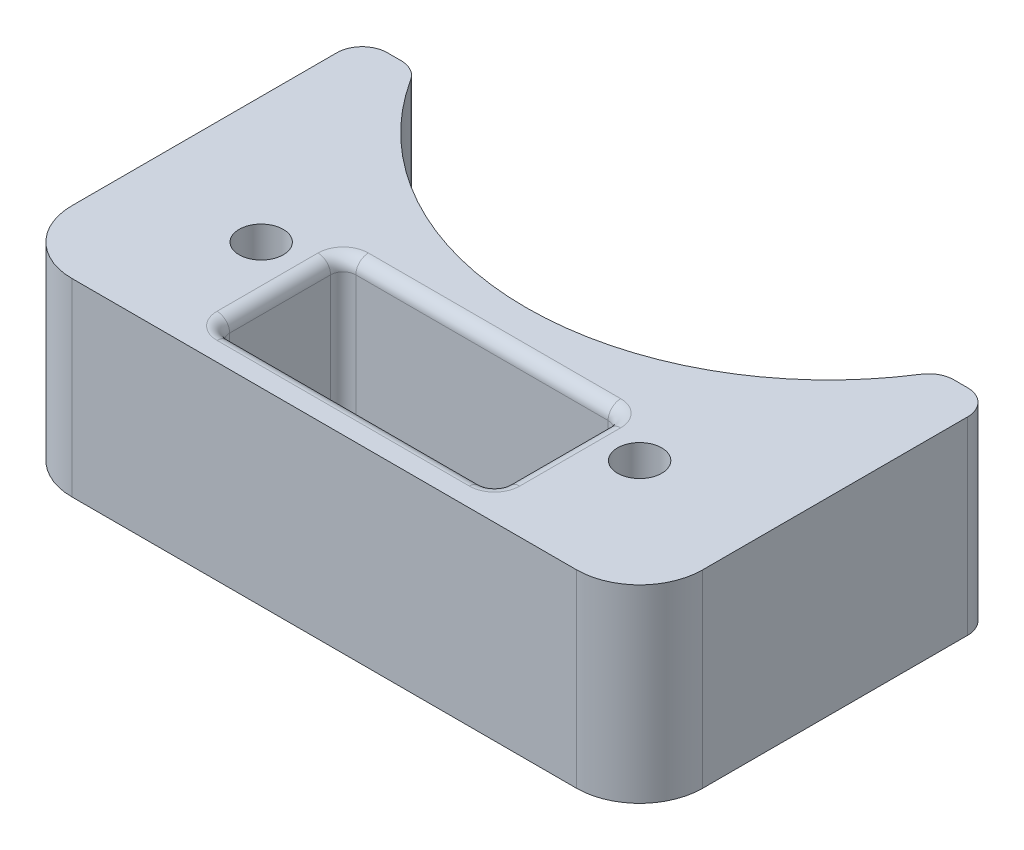
ISO-10303-21;
HEADER;
FILE_DESCRIPTION(('STEP AP214'),'2;1');
FILE_NAME('part.step','',(''),(''),'','','');
FILE_SCHEMA(('AUTOMOTIVE_DESIGN { 1 0 10303 214 1 1 1 1 }'));
ENDSEC;
DATA;
#1=APPLICATION_CONTEXT('core data for automotive mechanical design processes');
#2=APPLICATION_PROTOCOL_DEFINITION('international standard','automotive_design',2000,#1);
#3=PRODUCT_CONTEXT('',#1,'mechanical');
#4=PRODUCT('Part','Part','',(#3));
#5=PRODUCT_RELATED_PRODUCT_CATEGORY('part','',(#4));
#6=PRODUCT_DEFINITION_FORMATION('','',#4);
#7=PRODUCT_DEFINITION_CONTEXT('part definition',#1,'design');
#8=PRODUCT_DEFINITION('design','',#6,#7);
#9=PRODUCT_DEFINITION_SHAPE('','',#8);
#10=(LENGTH_UNIT() NAMED_UNIT(*) SI_UNIT(.MILLI.,.METRE.));
#11=(NAMED_UNIT(*) PLANE_ANGLE_UNIT() SI_UNIT($,.RADIAN.));
#12=(NAMED_UNIT(*) SI_UNIT($,.STERADIAN.) SOLID_ANGLE_UNIT());
#13=UNCERTAINTY_MEASURE_WITH_UNIT(LENGTH_MEASURE(1.E-05),#10,'distance_accuracy_value','');
#14=(GEOMETRIC_REPRESENTATION_CONTEXT(3) GLOBAL_UNCERTAINTY_ASSIGNED_CONTEXT((#13)) GLOBAL_UNIT_ASSIGNED_CONTEXT((#10,
#11,#12)) REPRESENTATION_CONTEXT('',''));
#15=CARTESIAN_POINT('',(0.,0.,0.));
#16=DIRECTION('',(0.,0.,1.));
#17=DIRECTION('',(1.,0.,0.));
#18=AXIS2_PLACEMENT_3D('',#15,#16,#17);
#19=CARTESIAN_POINT('',(0.,15.,0.));
#20=DIRECTION('',(0.,-1.,0.));
#21=DIRECTION('',(0.,0.,-1.));
#22=AXIS2_PLACEMENT_3D('',#19,#20,#21);
#23=PLANE('',#22);
#24=DIRECTION('',(0.,0.,1.));
#25=VECTOR('',#24,1.);
#26=CARTESIAN_POINT('',(-25.,15.,25.));
#27=LINE('',#26,#25);
#28=CARTESIAN_POINT('',(-25.,15.,14.));
#29=VERTEX_POINT('',#28);
#30=CARTESIAN_POINT('',(-25.,15.,35.));
#31=VERTEX_POINT('',#30);
#32=EDGE_CURVE('E301',#29,#31,#27,.T.);
#33=ORIENTED_EDGE('',*,*,#32,.T.);
#34=CARTESIAN_POINT('',(-20.,15.,35.));
#35=DIRECTION('',(0.,-1.,0.));
#36=DIRECTION('',(0.,0.,-1.));
#37=AXIS2_PLACEMENT_3D('',#34,#35,#36);
#38=CIRCLE('',#37,5.);
#39=CARTESIAN_POINT('',(-20.,15.,40.));
#40=VERTEX_POINT('',#39);
#41=EDGE_CURVE('E359',#31,#40,#38,.F.);
#42=ORIENTED_EDGE('',*,*,#41,.T.);
#43=DIRECTION('',(1.,0.,0.));
#44=VECTOR('',#43,1.);
#45=CARTESIAN_POINT('',(0.,15.,40.));
#46=LINE('',#45,#44);
#47=CARTESIAN_POINT('',(20.,15.,40.));
#48=VERTEX_POINT('',#47);
#49=EDGE_CURVE('E602',#40,#48,#46,.T.);
#50=ORIENTED_EDGE('',*,*,#49,.T.);
#51=CARTESIAN_POINT('',(20.,15.,35.));
#52=DIRECTION('',(0.,-1.,0.));
#53=DIRECTION('',(0.,0.,-1.));
#54=AXIS2_PLACEMENT_3D('',#51,#52,#53);
#55=CIRCLE('',#54,5.);
#56=CARTESIAN_POINT('',(25.,15.,35.));
#57=VERTEX_POINT('',#56);
#58=EDGE_CURVE('E356',#48,#57,#55,.F.);
#59=ORIENTED_EDGE('',*,*,#58,.T.);
#60=DIRECTION('',(0.,0.,-1.));
#61=VECTOR('',#60,1.);
#62=CARTESIAN_POINT('',(25.,15.,25.));
#63=LINE('',#62,#61);
#64=CARTESIAN_POINT('',(25.,15.,14.));
#65=VERTEX_POINT('',#64);
#66=EDGE_CURVE('E299',#57,#65,#63,.T.);
#67=ORIENTED_EDGE('',*,*,#66,.T.);
#68=CARTESIAN_POINT('',(23.,15.,14.));
#69=DIRECTION('',(0.,-1.,0.));
#70=DIRECTION('',(0.,0.,-1.));
#71=AXIS2_PLACEMENT_3D('',#68,#69,#70);
#72=CIRCLE('',#71,2.);
#73=CARTESIAN_POINT('',(23.,15.,12.));
#74=VERTEX_POINT('',#73);
#75=EDGE_CURVE('E259',#65,#74,#72,.F.);
#76=ORIENTED_EDGE('',*,*,#75,.T.);
#77=DIRECTION('',(1.,0.,0.));
#78=VECTOR('',#77,1.);
#79=CARTESIAN_POINT('',(0.,15.,12.));
#80=LINE('',#79,#78);
#81=CARTESIAN_POINT('',(21.9089023002066,15.,12.));
#82=VERTEX_POINT('',#81);
#83=EDGE_CURVE('E266',#82,#74,#80,.T.);
#84=ORIENTED_EDGE('',*,*,#83,.F.);
#85=CARTESIAN_POINT('',(21.9089023002066,15.,14.));
#86=DIRECTION('',(0.,-1.,0.));
#87=DIRECTION('',(0.,0.,-1.));
#88=AXIS2_PLACEMENT_3D('',#85,#86,#87);
#89=CIRCLE('',#88,2.);
#90=CARTESIAN_POINT('',(20.2236021232677,15.,12.9230769230769));
#91=VERTEX_POINT('',#90);
#92=EDGE_CURVE('E314',#82,#91,#89,.F.);
#93=ORIENTED_EDGE('',*,*,#92,.T.);
#94=CARTESIAN_POINT('',(0.,15.,0.));
#95=DIRECTION('',(0.,1.,0.));
#96=DIRECTION('',(0.,0.,1.));
#97=AXIS2_PLACEMENT_3D('',#94,#95,#96);
#98=CIRCLE('',#97,24.);
#99=CARTESIAN_POINT('',(-20.2236021232677,15.,12.9230769230769));
#100=VERTEX_POINT('',#99);
#101=EDGE_CURVE('E277',#100,#91,#98,.T.);
#102=ORIENTED_EDGE('',*,*,#101,.F.);
#103=CARTESIAN_POINT('',(-21.9089023002066,15.,14.));
#104=DIRECTION('',(0.,-1.,0.));
#105=DIRECTION('',(0.,0.,-1.));
#106=AXIS2_PLACEMENT_3D('',#103,#104,#105);
#107=CIRCLE('',#106,2.);
#108=CARTESIAN_POINT('',(-21.9089023002066,15.,12.));
#109=VERTEX_POINT('',#108);
#110=EDGE_CURVE('E248',#100,#109,#107,.F.);
#111=ORIENTED_EDGE('',*,*,#110,.T.);
#112=CARTESIAN_POINT('',(-23.,15.,12.));
#113=VERTEX_POINT('',#112);
#114=EDGE_CURVE('E254',#113,#109,#80,.T.);
#115=ORIENTED_EDGE('',*,*,#114,.F.);
#116=CARTESIAN_POINT('',(-23.,15.,14.));
#117=DIRECTION('',(0.,-1.,0.));
#118=DIRECTION('',(0.,0.,-1.));
#119=AXIS2_PLACEMENT_3D('',#116,#117,#118);
#120=CIRCLE('',#119,2.);
#121=EDGE_CURVE('E237',#113,#29,#120,.F.);
#122=ORIENTED_EDGE('',*,*,#121,.T.);
#123=EDGE_LOOP('',(#33,#42,#50,#59,#67,#76,#84,#93,#102,#111,#115,#122));
#124=FACE_BOUND('',#123,.T.);
#125=CARTESIAN_POINT('',(-15.,15.,30.));
#126=DIRECTION('',(0.,1.,0.));
#127=DIRECTION('',(0.,0.,1.));
#128=AXIS2_PLACEMENT_3D('',#125,#126,#127);
#129=CIRCLE('',#128,1.75);
#130=CARTESIAN_POINT('',(-15.,15.,31.75));
#131=VERTEX_POINT('',#130);
#132=EDGE_CURVE('E286',#131,#131,#129,.T.);
#133=ORIENTED_EDGE('',*,*,#132,.F.);
#134=EDGE_LOOP('',(#133));
#135=FACE_BOUND('',#134,.T.);
#136=CARTESIAN_POINT('',(15.,15.,30.));
#137=DIRECTION('',(0.,1.,0.));
#138=DIRECTION('',(0.,0.,1.));
#139=AXIS2_PLACEMENT_3D('',#136,#137,#138);
#140=CIRCLE('',#139,1.75);
#141=CARTESIAN_POINT('',(15.,15.,31.75));
#142=VERTEX_POINT('',#141);
#143=EDGE_CURVE('E290',#142,#142,#140,.T.);
#144=ORIENTED_EDGE('',*,*,#143,.F.);
#145=EDGE_LOOP('',(#144));
#146=FACE_BOUND('',#145,.T.);
#147=CARTESIAN_POINT('',(9.99999999999999,15.,28.5));
#148=DIRECTION('',(0.,-1.,0.));
#149=DIRECTION('',(0.,0.,-1.));
#150=AXIS2_PLACEMENT_3D('',#147,#148,#149);
#151=CIRCLE('',#150,2.);
#152=CARTESIAN_POINT('',(12.,15.,28.5));
#153=VERTEX_POINT('',#152);
#154=CARTESIAN_POINT('',(9.99999999999999,15.,26.5));
#155=VERTEX_POINT('',#154);
#156=EDGE_CURVE('E444',#153,#155,#151,.F.);
#157=ORIENTED_EDGE('',*,*,#156,.F.);
#158=DIRECTION('',(0.,0.,-1.));
#159=VECTOR('',#158,1.);
#160=CARTESIAN_POINT('',(12.,15.,0.));
#161=LINE('',#160,#159);
#162=CARTESIAN_POINT('',(12.,15.,36.5));
#163=VERTEX_POINT('',#162);
#164=EDGE_CURVE('E441',#153,#163,#161,.F.);
#165=ORIENTED_EDGE('',*,*,#164,.T.);
#166=CARTESIAN_POINT('',(9.99999999999999,15.,36.5));
#167=DIRECTION('',(0.,-1.,0.));
#168=DIRECTION('',(0.,0.,-1.));
#169=AXIS2_PLACEMENT_3D('',#166,#167,#168);
#170=CIRCLE('',#169,2.);
#171=CARTESIAN_POINT('',(9.99999999999999,15.,38.5));
#172=VERTEX_POINT('',#171);
#173=EDGE_CURVE('E437',#172,#163,#170,.F.);
#174=ORIENTED_EDGE('',*,*,#173,.F.);
#175=DIRECTION('',(1.,0.,0.));
#176=VECTOR('',#175,1.);
#177=CARTESIAN_POINT('',(0.,15.,38.5));
#178=LINE('',#177,#176);
#179=CARTESIAN_POINT('',(-10.,15.,38.5));
#180=VERTEX_POINT('',#179);
#181=EDGE_CURVE('E430',#172,#180,#178,.F.);
#182=ORIENTED_EDGE('',*,*,#181,.T.);
#183=CARTESIAN_POINT('',(-10.,15.,36.5));
#184=DIRECTION('',(0.,-1.,0.));
#185=DIRECTION('',(0.,0.,-1.));
#186=AXIS2_PLACEMENT_3D('',#183,#184,#185);
#187=CIRCLE('',#186,2.);
#188=CARTESIAN_POINT('',(-12.,15.,36.5));
#189=VERTEX_POINT('',#188);
#190=EDGE_CURVE('E426',#189,#180,#187,.F.);
#191=ORIENTED_EDGE('',*,*,#190,.F.);
#192=DIRECTION('',(0.,0.,1.));
#193=VECTOR('',#192,1.);
#194=CARTESIAN_POINT('',(-12.,15.,0.));
#195=LINE('',#194,#193);
#196=CARTESIAN_POINT('',(-12.,15.,28.5));
#197=VERTEX_POINT('',#196);
#198=EDGE_CURVE('E424',#189,#197,#195,.F.);
#199=ORIENTED_EDGE('',*,*,#198,.T.);
#200=CARTESIAN_POINT('',(-10.,15.,28.5));
#201=DIRECTION('',(0.,-1.,0.));
#202=DIRECTION('',(0.,0.,-1.));
#203=AXIS2_PLACEMENT_3D('',#200,#201,#202);
#204=CIRCLE('',#203,2.);
#205=CARTESIAN_POINT('',(-10.,15.,26.5));
#206=VERTEX_POINT('',#205);
#207=EDGE_CURVE('E420',#206,#197,#204,.F.);
#208=ORIENTED_EDGE('',*,*,#207,.F.);
#209=DIRECTION('',(-1.,0.,0.));
#210=VECTOR('',#209,1.);
#211=CARTESIAN_POINT('',(0.,15.,26.5));
#212=LINE('',#211,#210);
#213=EDGE_CURVE('E433',#206,#155,#212,.F.);
#214=ORIENTED_EDGE('',*,*,#213,.T.);
#215=EDGE_LOOP('',(#157,#165,#174,#182,#191,#199,#208,#214));
#216=FACE_BOUND('',#215,.T.);
#217=ADVANCED_FACE('F51',(#124,#135,#146,#216),#23,.F.);
#218=CARTESIAN_POINT('',(0.,0.,0.));
#219=DIRECTION('',(0.,-1.,0.));
#220=DIRECTION('',(0.,0.,-1.));
#221=AXIS2_PLACEMENT_3D('',#218,#219,#220);
#222=PLANE('',#221);
#223=DIRECTION('',(1.,0.,0.));
#224=VECTOR('',#223,1.);
#225=CARTESIAN_POINT('',(0.,0.,40.));
#226=LINE('',#225,#224);
#227=CARTESIAN_POINT('',(-20.,0.,40.));
#228=VERTEX_POINT('',#227);
#229=CARTESIAN_POINT('',(20.,0.,40.));
#230=VERTEX_POINT('',#229);
#231=EDGE_CURVE('E298',#228,#230,#226,.T.);
#232=ORIENTED_EDGE('',*,*,#231,.F.);
#233=CARTESIAN_POINT('',(-20.,0.,35.));
#234=DIRECTION('',(0.,-1.,0.));
#235=DIRECTION('',(0.,0.,-1.));
#236=AXIS2_PLACEMENT_3D('',#233,#234,#235);
#237=CIRCLE('',#236,5.);
#238=CARTESIAN_POINT('',(-25.,0.,35.));
#239=VERTEX_POINT('',#238);
#240=EDGE_CURVE('E372',#228,#239,#237,.T.);
#241=ORIENTED_EDGE('',*,*,#240,.T.);
#242=DIRECTION('',(0.,0.,1.));
#243=VECTOR('',#242,1.);
#244=CARTESIAN_POINT('',(-25.,0.,25.));
#245=LINE('',#244,#243);
#246=CARTESIAN_POINT('',(-25.,0.,14.));
#247=VERTEX_POINT('',#246);
#248=EDGE_CURVE('E302',#247,#239,#245,.T.);
#249=ORIENTED_EDGE('',*,*,#248,.F.);
#250=CARTESIAN_POINT('',(-23.,0.,14.));
#251=DIRECTION('',(0.,-1.,0.));
#252=DIRECTION('',(0.,0.,-1.));
#253=AXIS2_PLACEMENT_3D('',#250,#251,#252);
#254=CIRCLE('',#253,2.);
#255=CARTESIAN_POINT('',(-23.,0.,12.));
#256=VERTEX_POINT('',#255);
#257=EDGE_CURVE('E331',#247,#256,#254,.T.);
#258=ORIENTED_EDGE('',*,*,#257,.T.);
#259=DIRECTION('',(1.,0.,0.));
#260=VECTOR('',#259,1.);
#261=CARTESIAN_POINT('',(0.,0.,12.));
#262=LINE('',#261,#260);
#263=CARTESIAN_POINT('',(-21.9089023002066,0.,12.));
#264=VERTEX_POINT('',#263);
#265=EDGE_CURVE('E257',#256,#264,#262,.T.);
#266=ORIENTED_EDGE('',*,*,#265,.T.);
#267=CARTESIAN_POINT('',(-21.9089023002066,0.,14.));
#268=DIRECTION('',(0.,-1.,0.));
#269=DIRECTION('',(0.,0.,-1.));
#270=AXIS2_PLACEMENT_3D('',#267,#268,#269);
#271=CIRCLE('',#270,2.);
#272=CARTESIAN_POINT('',(-20.2236021232677,0.,12.9230769230769));
#273=VERTEX_POINT('',#272);
#274=EDGE_CURVE('E328',#264,#273,#271,.T.);
#275=ORIENTED_EDGE('',*,*,#274,.T.);
#276=CARTESIAN_POINT('',(0.,0.,0.));
#277=DIRECTION('',(0.,1.,0.));
#278=DIRECTION('',(0.,0.,1.));
#279=AXIS2_PLACEMENT_3D('',#276,#277,#278);
#280=CIRCLE('',#279,24.);
#281=CARTESIAN_POINT('',(20.2236021232677,0.,12.9230769230769));
#282=VERTEX_POINT('',#281);
#283=EDGE_CURVE('E265',#273,#282,#280,.T.);
#284=ORIENTED_EDGE('',*,*,#283,.T.);
#285=CARTESIAN_POINT('',(21.9089023002066,0.,14.));
#286=DIRECTION('',(0.,-1.,0.));
#287=DIRECTION('',(0.,0.,-1.));
#288=AXIS2_PLACEMENT_3D('',#285,#286,#287);
#289=CIRCLE('',#288,2.);
#290=CARTESIAN_POINT('',(21.9089023002066,0.,12.));
#291=VERTEX_POINT('',#290);
#292=EDGE_CURVE('E325',#282,#291,#289,.T.);
#293=ORIENTED_EDGE('',*,*,#292,.T.);
#294=CARTESIAN_POINT('',(23.,0.,12.));
#295=VERTEX_POINT('',#294);
#296=EDGE_CURVE('E273',#291,#295,#262,.T.);
#297=ORIENTED_EDGE('',*,*,#296,.T.);
#298=CARTESIAN_POINT('',(23.,0.,14.));
#299=DIRECTION('',(0.,-1.,0.));
#300=DIRECTION('',(0.,0.,-1.));
#301=AXIS2_PLACEMENT_3D('',#298,#299,#300);
#302=CIRCLE('',#301,2.);
#303=CARTESIAN_POINT('',(25.,0.,14.));
#304=VERTEX_POINT('',#303);
#305=EDGE_CURVE('E321',#295,#304,#302,.T.);
#306=ORIENTED_EDGE('',*,*,#305,.T.);
#307=DIRECTION('',(0.,0.,-1.));
#308=VECTOR('',#307,1.);
#309=CARTESIAN_POINT('',(25.,0.,25.));
#310=LINE('',#309,#308);
#311=CARTESIAN_POINT('',(25.,0.,35.));
#312=VERTEX_POINT('',#311);
#313=EDGE_CURVE('E285',#312,#304,#310,.T.);
#314=ORIENTED_EDGE('',*,*,#313,.F.);
#315=CARTESIAN_POINT('',(20.,0.,35.));
#316=DIRECTION('',(0.,-1.,0.));
#317=DIRECTION('',(0.,0.,-1.));
#318=AXIS2_PLACEMENT_3D('',#315,#316,#317);
#319=CIRCLE('',#318,5.);
#320=EDGE_CURVE('E369',#312,#230,#319,.T.);
#321=ORIENTED_EDGE('',*,*,#320,.T.);
#322=EDGE_LOOP('',(#232,#241,#249,#258,#266,#275,#284,#293,#297,#306,#314,#321));
#323=FACE_BOUND('',#322,.T.);
#324=CARTESIAN_POINT('',(-15.,0.,30.));
#325=DIRECTION('',(0.,1.,0.));
#326=DIRECTION('',(0.,0.,1.));
#327=AXIS2_PLACEMENT_3D('',#324,#325,#326);
#328=CIRCLE('',#327,1.75);
#329=CARTESIAN_POINT('',(-15.,0.,31.75));
#330=VERTEX_POINT('',#329);
#331=EDGE_CURVE('E281',#330,#330,#328,.T.);
#332=ORIENTED_EDGE('',*,*,#331,.T.);
#333=EDGE_LOOP('',(#332));
#334=FACE_BOUND('',#333,.T.);
#335=CARTESIAN_POINT('',(15.,0.,30.));
#336=DIRECTION('',(0.,1.,0.));
#337=DIRECTION('',(0.,0.,1.));
#338=AXIS2_PLACEMENT_3D('',#335,#336,#337);
#339=CIRCLE('',#338,1.75);
#340=CARTESIAN_POINT('',(15.,0.,31.75));
#341=VERTEX_POINT('',#340);
#342=EDGE_CURVE('E294',#341,#341,#339,.T.);
#343=ORIENTED_EDGE('',*,*,#342,.T.);
#344=EDGE_LOOP('',(#343));
#345=FACE_BOUND('',#344,.T.);
#346=CARTESIAN_POINT('',(9.99999999999999,0.,36.5));
#347=DIRECTION('',(0.,-1.,0.));
#348=DIRECTION('',(0.,0.,-1.));
#349=AXIS2_PLACEMENT_3D('',#346,#347,#348);
#350=CIRCLE('',#349,2.);
#351=CARTESIAN_POINT('',(12.,0.,36.5));
#352=VERTEX_POINT('',#351);
#353=CARTESIAN_POINT('',(9.99999999999999,0.,38.5));
#354=VERTEX_POINT('',#353);
#355=EDGE_CURVE('E403',#352,#354,#350,.T.);
#356=ORIENTED_EDGE('',*,*,#355,.F.);
#357=DIRECTION('',(0.,0.,-1.));
#358=VECTOR('',#357,1.);
#359=CARTESIAN_POINT('',(12.,0.,27.5));
#360=LINE('',#359,#358);
#361=CARTESIAN_POINT('',(12.,0.,28.5));
#362=VERTEX_POINT('',#361);
#363=EDGE_CURVE('E400',#352,#362,#360,.T.);
#364=ORIENTED_EDGE('',*,*,#363,.T.);
#365=CARTESIAN_POINT('',(9.99999999999999,0.,28.5));
#366=DIRECTION('',(0.,-1.,0.));
#367=DIRECTION('',(0.,0.,-1.));
#368=AXIS2_PLACEMENT_3D('',#365,#366,#367);
#369=CIRCLE('',#368,2.);
#370=CARTESIAN_POINT('',(9.99999999999999,0.,26.5));
#371=VERTEX_POINT('',#370);
#372=EDGE_CURVE('E396',#371,#362,#369,.T.);
#373=ORIENTED_EDGE('',*,*,#372,.F.);
#374=DIRECTION('',(-1.,0.,0.));
#375=VECTOR('',#374,1.);
#376=CARTESIAN_POINT('',(-11.,0.,26.5));
#377=LINE('',#376,#375);
#378=CARTESIAN_POINT('',(-10.,0.,26.5));
#379=VERTEX_POINT('',#378);
#380=EDGE_CURVE('E392',#371,#379,#377,.T.);
#381=ORIENTED_EDGE('',*,*,#380,.T.);
#382=CARTESIAN_POINT('',(-10.,0.,28.5));
#383=DIRECTION('',(0.,-1.,0.));
#384=DIRECTION('',(0.,0.,-1.));
#385=AXIS2_PLACEMENT_3D('',#382,#383,#384);
#386=CIRCLE('',#385,2.);
#387=CARTESIAN_POINT('',(-12.,0.,28.5));
#388=VERTEX_POINT('',#387);
#389=EDGE_CURVE('E388',#388,#379,#386,.T.);
#390=ORIENTED_EDGE('',*,*,#389,.F.);
#391=DIRECTION('',(0.,0.,1.));
#392=VECTOR('',#391,1.);
#393=CARTESIAN_POINT('',(-12.,0.,37.5));
#394=LINE('',#393,#392);
#395=CARTESIAN_POINT('',(-12.,0.,36.5));
#396=VERTEX_POINT('',#395);
#397=EDGE_CURVE('E382',#388,#396,#394,.T.);
#398=ORIENTED_EDGE('',*,*,#397,.T.);
#399=CARTESIAN_POINT('',(-10.,0.,36.5));
#400=DIRECTION('',(0.,-1.,0.));
#401=DIRECTION('',(0.,0.,-1.));
#402=AXIS2_PLACEMENT_3D('',#399,#400,#401);
#403=CIRCLE('',#402,2.);
#404=CARTESIAN_POINT('',(-10.,0.,38.5));
#405=VERTEX_POINT('',#404);
#406=EDGE_CURVE('E378',#405,#396,#403,.T.);
#407=ORIENTED_EDGE('',*,*,#406,.F.);
#408=DIRECTION('',(1.,0.,0.));
#409=VECTOR('',#408,1.);
#410=CARTESIAN_POINT('',(11.,0.,38.5));
#411=LINE('',#410,#409);
#412=EDGE_CURVE('E385',#405,#354,#411,.T.);
#413=ORIENTED_EDGE('',*,*,#412,.T.);
#414=EDGE_LOOP('',(#356,#364,#373,#381,#390,#398,#407,#413));
#415=FACE_BOUND('',#414,.T.);
#416=ADVANCED_FACE('F592',(#323,#334,#345,#415),#222,.T.);
#417=CARTESIAN_POINT('',(25.,15.,25.));
#418=DIRECTION('',(-1.,0.,0.));
#419=DIRECTION('',(0.,0.,1.));
#420=AXIS2_PLACEMENT_3D('',#417,#418,#419);
#421=PLANE('',#420);
#422=ORIENTED_EDGE('',*,*,#66,.F.);
#423=DIRECTION('',(0.,1.,0.));
#424=VECTOR('',#423,1.);
#425=CARTESIAN_POINT('',(25.,0.,35.));
#426=LINE('',#425,#424);
#427=EDGE_CURVE('E375',#57,#312,#426,.F.);
#428=ORIENTED_EDGE('',*,*,#427,.T.);
#429=ORIENTED_EDGE('',*,*,#313,.T.);
#430=DIRECTION('',(0.,1.,0.));
#431=VECTOR('',#430,1.);
#432=CARTESIAN_POINT('',(25.,15.,14.));
#433=LINE('',#432,#431);
#434=EDGE_CURVE('E348',#304,#65,#433,.T.);
#435=ORIENTED_EDGE('',*,*,#434,.T.);
#436=EDGE_LOOP('',(#422,#428,#429,#435));
#437=FACE_BOUND('',#436,.T.);
#438=ADVANCED_FACE('F623',(#437),#421,.F.);
#439=CARTESIAN_POINT('',(-25.,15.,25.));
#440=DIRECTION('',(1.,0.,0.));
#441=DIRECTION('',(0.,0.,-1.));
#442=AXIS2_PLACEMENT_3D('',#439,#440,#441);
#443=PLANE('',#442);
#444=ORIENTED_EDGE('',*,*,#248,.T.);
#445=DIRECTION('',(0.,1.,0.));
#446=VECTOR('',#445,1.);
#447=CARTESIAN_POINT('',(-25.,15.,35.));
#448=LINE('',#447,#446);
#449=EDGE_CURVE('E352',#239,#31,#448,.T.);
#450=ORIENTED_EDGE('',*,*,#449,.T.);
#451=ORIENTED_EDGE('',*,*,#32,.F.);
#452=DIRECTION('',(0.,1.,0.));
#453=VECTOR('',#452,1.);
#454=CARTESIAN_POINT('',(-25.,15.,14.));
#455=LINE('',#454,#453);
#456=EDGE_CURVE('E242',#29,#247,#455,.F.);
#457=ORIENTED_EDGE('',*,*,#456,.T.);
#458=EDGE_LOOP('',(#444,#450,#451,#457));
#459=FACE_BOUND('',#458,.T.);
#460=ADVANCED_FACE('F647',(#459),#443,.F.);
#461=CARTESIAN_POINT('',(15.,0.,30.));
#462=DIRECTION('',(0.,1.,0.));
#463=DIRECTION('',(0.,0.,1.));
#464=AXIS2_PLACEMENT_3D('',#461,#462,#463);
#465=CYLINDRICAL_SURFACE('',#464,1.75);
#466=ORIENTED_EDGE('',*,*,#342,.F.);
#467=EDGE_LOOP('',(#466));
#468=FACE_BOUND('',#467,.T.);
#469=ORIENTED_EDGE('',*,*,#143,.T.);
#470=EDGE_LOOP('',(#469));
#471=FACE_BOUND('',#470,.T.);
#472=ADVANCED_FACE('F644',(#468,#471),#465,.F.);
#473=CARTESIAN_POINT('',(-15.,0.,30.));
#474=DIRECTION('',(0.,1.,0.));
#475=DIRECTION('',(0.,0.,1.));
#476=AXIS2_PLACEMENT_3D('',#473,#474,#475);
#477=CYLINDRICAL_SURFACE('',#476,1.75);
#478=ORIENTED_EDGE('',*,*,#331,.F.);
#479=EDGE_LOOP('',(#478));
#480=FACE_BOUND('',#479,.T.);
#481=ORIENTED_EDGE('',*,*,#132,.T.);
#482=EDGE_LOOP('',(#481));
#483=FACE_BOUND('',#482,.T.);
#484=ADVANCED_FACE('F1021',(#480,#483),#477,.F.);
#485=CARTESIAN_POINT('',(0.,0.,0.));
#486=DIRECTION('',(0.,1.,0.));
#487=DIRECTION('',(0.,0.,1.));
#488=AXIS2_PLACEMENT_3D('',#485,#486,#487);
#489=CYLINDRICAL_SURFACE('',#488,24.);
#490=ORIENTED_EDGE('',*,*,#283,.F.);
#491=DIRECTION('',(0.,1.,0.));
#492=VECTOR('',#491,1.);
#493=CARTESIAN_POINT('',(-20.2236021232677,0.,12.9230769230769));
#494=LINE('',#493,#492);
#495=EDGE_CURVE('E337',#273,#100,#494,.T.);
#496=ORIENTED_EDGE('',*,*,#495,.T.);
#497=ORIENTED_EDGE('',*,*,#101,.T.);
#498=DIRECTION('',(0.,1.,0.));
#499=VECTOR('',#498,1.);
#500=CARTESIAN_POINT('',(20.2236021232677,0.,12.9230769230769));
#501=LINE('',#500,#499);
#502=EDGE_CURVE('E334',#91,#282,#501,.F.);
#503=ORIENTED_EDGE('',*,*,#502,.T.);
#504=EDGE_LOOP('',(#490,#496,#497,#503));
#505=FACE_BOUND('',#504,.T.);
#506=ADVANCED_FACE('F582',(#505),#489,.F.);
#507=CARTESIAN_POINT('',(0.,0.,12.));
#508=DIRECTION('',(0.,0.,1.));
#509=DIRECTION('',(1.,0.,0.));
#510=AXIS2_PLACEMENT_3D('',#507,#508,#509);
#511=PLANE('',#510);
#512=ORIENTED_EDGE('',*,*,#265,.F.);
#513=DIRECTION('',(0.,1.,0.));
#514=VECTOR('',#513,1.);
#515=CARTESIAN_POINT('',(-23.,0.,12.));
#516=LINE('',#515,#514);
#517=EDGE_CURVE('E241',#256,#113,#516,.T.);
#518=ORIENTED_EDGE('',*,*,#517,.T.);
#519=ORIENTED_EDGE('',*,*,#114,.T.);
#520=DIRECTION('',(0.,1.,0.));
#521=VECTOR('',#520,1.);
#522=CARTESIAN_POINT('',(-21.9089023002066,0.,12.));
#523=LINE('',#522,#521);
#524=EDGE_CURVE('E260',#109,#264,#523,.F.);
#525=ORIENTED_EDGE('',*,*,#524,.T.);
#526=EDGE_LOOP('',(#512,#518,#519,#525));
#527=FACE_BOUND('',#526,.T.);
#528=ADVANCED_FACE('F253',(#527),#511,.F.);
#529=ORIENTED_EDGE('',*,*,#296,.F.);
#530=DIRECTION('',(0.,1.,0.));
#531=VECTOR('',#530,1.);
#532=CARTESIAN_POINT('',(21.9089023002066,0.,12.));
#533=LINE('',#532,#531);
#534=EDGE_CURVE('E344',#291,#82,#533,.T.);
#535=ORIENTED_EDGE('',*,*,#534,.T.);
#536=ORIENTED_EDGE('',*,*,#83,.T.);
#537=DIRECTION('',(0.,1.,0.));
#538=VECTOR('',#537,1.);
#539=CARTESIAN_POINT('',(23.,0.,12.));
#540=LINE('',#539,#538);
#541=EDGE_CURVE('E341',#74,#295,#540,.F.);
#542=ORIENTED_EDGE('',*,*,#541,.T.);
#543=EDGE_LOOP('',(#529,#535,#536,#542));
#544=FACE_BOUND('',#543,.T.);
#545=ADVANCED_FACE('F596',(#544),#511,.F.);
#546=CARTESIAN_POINT('',(0.,0.,40.));
#547=DIRECTION('',(0.,0.,1.));
#548=DIRECTION('',(1.,0.,0.));
#549=AXIS2_PLACEMENT_3D('',#546,#547,#548);
#550=PLANE('',#549);
#551=ORIENTED_EDGE('',*,*,#49,.F.);
#552=DIRECTION('',(0.,1.,0.));
#553=VECTOR('',#552,1.);
#554=CARTESIAN_POINT('',(-20.,0.,40.));
#555=LINE('',#554,#553);
#556=EDGE_CURVE('E366',#40,#228,#555,.F.);
#557=ORIENTED_EDGE('',*,*,#556,.T.);
#558=ORIENTED_EDGE('',*,*,#231,.T.);
#559=DIRECTION('',(0.,1.,0.));
#560=VECTOR('',#559,1.);
#561=CARTESIAN_POINT('',(20.,15.,40.));
#562=LINE('',#561,#560);
#563=EDGE_CURVE('E362',#230,#48,#562,.T.);
#564=ORIENTED_EDGE('',*,*,#563,.T.);
#565=EDGE_LOOP('',(#551,#557,#558,#564));
#566=FACE_BOUND('',#565,.T.);
#567=ADVANCED_FACE('F613',(#566),#550,.T.);
#568=CARTESIAN_POINT('',(-23.,0.,14.));
#569=DIRECTION('',(0.,1.,0.));
#570=DIRECTION('',(0.,0.,1.));
#571=AXIS2_PLACEMENT_3D('',#568,#569,#570);
#572=CYLINDRICAL_SURFACE('',#571,2.);
#573=ORIENTED_EDGE('',*,*,#257,.F.);
#574=ORIENTED_EDGE('',*,*,#456,.F.);
#575=ORIENTED_EDGE('',*,*,#121,.F.);
#576=ORIENTED_EDGE('',*,*,#517,.F.);
#577=EDGE_LOOP('',(#573,#574,#575,#576));
#578=FACE_BOUND('',#577,.T.);
#579=ADVANCED_FACE('F240',(#578),#572,.T.);
#580=CARTESIAN_POINT('',(-21.9089023002066,0.,14.));
#581=DIRECTION('',(0.,1.,0.));
#582=DIRECTION('',(0.,0.,1.));
#583=AXIS2_PLACEMENT_3D('',#580,#581,#582);
#584=CYLINDRICAL_SURFACE('',#583,2.);
#585=ORIENTED_EDGE('',*,*,#274,.F.);
#586=ORIENTED_EDGE('',*,*,#524,.F.);
#587=ORIENTED_EDGE('',*,*,#110,.F.);
#588=ORIENTED_EDGE('',*,*,#495,.F.);
#589=EDGE_LOOP('',(#585,#586,#587,#588));
#590=FACE_BOUND('',#589,.T.);
#591=ADVANCED_FACE('F636',(#590),#584,.T.);
#592=CARTESIAN_POINT('',(21.9089023002066,0.,14.));
#593=DIRECTION('',(0.,1.,0.));
#594=DIRECTION('',(0.,0.,1.));
#595=AXIS2_PLACEMENT_3D('',#592,#593,#594);
#596=CYLINDRICAL_SURFACE('',#595,2.);
#597=ORIENTED_EDGE('',*,*,#292,.F.);
#598=ORIENTED_EDGE('',*,*,#502,.F.);
#599=ORIENTED_EDGE('',*,*,#92,.F.);
#600=ORIENTED_EDGE('',*,*,#534,.F.);
#601=EDGE_LOOP('',(#597,#598,#599,#600));
#602=FACE_BOUND('',#601,.T.);
#603=ADVANCED_FACE('F586',(#602),#596,.T.);
#604=CARTESIAN_POINT('',(23.,15.,14.));
#605=DIRECTION('',(0.,1.,0.));
#606=DIRECTION('',(0.,0.,1.));
#607=AXIS2_PLACEMENT_3D('',#604,#605,#606);
#608=CYLINDRICAL_SURFACE('',#607,2.);
#609=ORIENTED_EDGE('',*,*,#305,.F.);
#610=ORIENTED_EDGE('',*,*,#541,.F.);
#611=ORIENTED_EDGE('',*,*,#75,.F.);
#612=ORIENTED_EDGE('',*,*,#434,.F.);
#613=EDGE_LOOP('',(#609,#610,#611,#612));
#614=FACE_BOUND('',#613,.T.);
#615=ADVANCED_FACE('F627',(#614),#608,.T.);
#616=CARTESIAN_POINT('',(-20.,15.,35.));
#617=DIRECTION('',(0.,-1.,0.));
#618=DIRECTION('',(0.,0.,-1.));
#619=AXIS2_PLACEMENT_3D('',#616,#617,#618);
#620=CYLINDRICAL_SURFACE('',#619,5.);
#621=ORIENTED_EDGE('',*,*,#240,.F.);
#622=ORIENTED_EDGE('',*,*,#556,.F.);
#623=ORIENTED_EDGE('',*,*,#41,.F.);
#624=ORIENTED_EDGE('',*,*,#449,.F.);
#625=EDGE_LOOP('',(#621,#622,#623,#624));
#626=FACE_BOUND('',#625,.T.);
#627=ADVANCED_FACE('F629',(#626),#620,.T.);
#628=CARTESIAN_POINT('',(20.,0.,35.));
#629=DIRECTION('',(0.,-1.,0.));
#630=DIRECTION('',(0.,0.,-1.));
#631=AXIS2_PLACEMENT_3D('',#628,#629,#630);
#632=CYLINDRICAL_SURFACE('',#631,5.);
#633=ORIENTED_EDGE('',*,*,#320,.F.);
#634=ORIENTED_EDGE('',*,*,#427,.F.);
#635=ORIENTED_EDGE('',*,*,#58,.F.);
#636=ORIENTED_EDGE('',*,*,#563,.F.);
#637=EDGE_LOOP('',(#633,#634,#635,#636));
#638=FACE_BOUND('',#637,.T.);
#639=ADVANCED_FACE('F618',(#638),#632,.T.);
#640=CARTESIAN_POINT('',(11.,0.,37.5));
#641=DIRECTION('',(1.,0.,0.));
#642=DIRECTION('',(0.,0.,-1.));
#643=AXIS2_PLACEMENT_3D('',#640,#641,#642);
#644=PLANE('',#643);
#645=DIRECTION('',(0.,0.,-1.));
#646=VECTOR('',#645,1.);
#647=CARTESIAN_POINT('',(11.,1.,37.5));
#648=LINE('',#647,#646);
#649=CARTESIAN_POINT('',(11.,1.,28.5));
#650=VERTEX_POINT('',#649);
#651=CARTESIAN_POINT('',(11.,1.,36.5));
#652=VERTEX_POINT('',#651);
#653=EDGE_CURVE('E466',#650,#652,#648,.F.);
#654=ORIENTED_EDGE('',*,*,#653,.T.);
#655=DIRECTION('',(0.,1.,0.));
#656=VECTOR('',#655,1.);
#657=CARTESIAN_POINT('',(11.,15.,36.5));
#658=LINE('',#657,#656);
#659=CARTESIAN_POINT('',(11.,14.,36.5));
#660=VERTEX_POINT('',#659);
#661=EDGE_CURVE('E469',#652,#660,#658,.T.);
#662=ORIENTED_EDGE('',*,*,#661,.T.);
#663=DIRECTION('',(0.,0.,-1.));
#664=VECTOR('',#663,1.);
#665=CARTESIAN_POINT('',(11.,14.,37.5));
#666=LINE('',#665,#664);
#667=CARTESIAN_POINT('',(11.,14.,28.5));
#668=VERTEX_POINT('',#667);
#669=EDGE_CURVE('E460',#660,#668,#666,.T.);
#670=ORIENTED_EDGE('',*,*,#669,.T.);
#671=DIRECTION('',(0.,1.,0.));
#672=VECTOR('',#671,1.);
#673=CARTESIAN_POINT('',(11.,0.,28.5));
#674=LINE('',#673,#672);
#675=EDGE_CURVE('E463',#668,#650,#674,.F.);
#676=ORIENTED_EDGE('',*,*,#675,.T.);
#677=EDGE_LOOP('',(#654,#662,#670,#676));
#678=FACE_BOUND('',#677,.T.);
#679=ADVANCED_FACE('F709',(#678),#644,.F.);
#680=CARTESIAN_POINT('',(-11.,0.,37.5));
#681=DIRECTION('',(0.,0.,1.));
#682=DIRECTION('',(1.,0.,0.));
#683=AXIS2_PLACEMENT_3D('',#680,#681,#682);
#684=PLANE('',#683);
#685=DIRECTION('',(1.,0.,0.));
#686=VECTOR('',#685,1.);
#687=CARTESIAN_POINT('',(-11.,14.,37.5));
#688=LINE('',#687,#686);
#689=CARTESIAN_POINT('',(-10.,14.,37.5));
#690=VERTEX_POINT('',#689);
#691=CARTESIAN_POINT('',(9.99999999999999,14.,37.5));
#692=VERTEX_POINT('',#691);
#693=EDGE_CURVE('E450',#690,#692,#688,.T.);
#694=ORIENTED_EDGE('',*,*,#693,.T.);
#695=DIRECTION('',(0.,1.,0.));
#696=VECTOR('',#695,1.);
#697=CARTESIAN_POINT('',(9.99999999999999,0.,37.5));
#698=LINE('',#697,#696);
#699=CARTESIAN_POINT('',(9.99999999999999,1.,37.5));
#700=VERTEX_POINT('',#699);
#701=EDGE_CURVE('E457',#692,#700,#698,.F.);
#702=ORIENTED_EDGE('',*,*,#701,.T.);
#703=DIRECTION('',(1.,0.,0.));
#704=VECTOR('',#703,1.);
#705=CARTESIAN_POINT('',(-11.,1.,37.5));
#706=LINE('',#705,#704);
#707=CARTESIAN_POINT('',(-10.,1.,37.5));
#708=VERTEX_POINT('',#707);
#709=EDGE_CURVE('E453',#700,#708,#706,.F.);
#710=ORIENTED_EDGE('',*,*,#709,.T.);
#711=DIRECTION('',(0.,1.,0.));
#712=VECTOR('',#711,1.);
#713=CARTESIAN_POINT('',(-10.,15.,37.5));
#714=LINE('',#713,#712);
#715=EDGE_CURVE('E447',#708,#690,#714,.T.);
#716=ORIENTED_EDGE('',*,*,#715,.T.);
#717=EDGE_LOOP('',(#694,#702,#710,#716));
#718=FACE_BOUND('',#717,.T.);
#719=ADVANCED_FACE('F732',(#718),#684,.F.);
#720=CARTESIAN_POINT('',(-11.,0.,37.5));
#721=DIRECTION('',(-1.,0.,0.));
#722=DIRECTION('',(0.,0.,1.));
#723=AXIS2_PLACEMENT_3D('',#720,#721,#722);
#724=PLANE('',#723);
#725=DIRECTION('',(0.,0.,1.));
#726=VECTOR('',#725,1.);
#727=CARTESIAN_POINT('',(-11.,1.,27.5));
#728=LINE('',#727,#726);
#729=CARTESIAN_POINT('',(-11.,1.,36.5));
#730=VERTEX_POINT('',#729);
#731=CARTESIAN_POINT('',(-11.,1.,28.5));
#732=VERTEX_POINT('',#731);
#733=EDGE_CURVE('E61',#730,#732,#728,.F.);
#734=ORIENTED_EDGE('',*,*,#733,.T.);
#735=DIRECTION('',(0.,1.,0.));
#736=VECTOR('',#735,1.);
#737=CARTESIAN_POINT('',(-11.,15.,28.5));
#738=LINE('',#737,#736);
#739=CARTESIAN_POINT('',(-11.,14.,28.5));
#740=VERTEX_POINT('',#739);
#741=EDGE_CURVE('E11',#732,#740,#738,.T.);
#742=ORIENTED_EDGE('',*,*,#741,.T.);
#743=DIRECTION('',(0.,0.,1.));
#744=VECTOR('',#743,1.);
#745=CARTESIAN_POINT('',(-11.,14.,37.5));
#746=LINE('',#745,#744);
#747=CARTESIAN_POINT('',(-11.,14.,36.5));
#748=VERTEX_POINT('',#747);
#749=EDGE_CURVE('E473',#740,#748,#746,.T.);
#750=ORIENTED_EDGE('',*,*,#749,.T.);
#751=DIRECTION('',(0.,1.,0.));
#752=VECTOR('',#751,1.);
#753=CARTESIAN_POINT('',(-11.,0.,36.5));
#754=LINE('',#753,#752);
#755=EDGE_CURVE('E72',#748,#730,#754,.F.);
#756=ORIENTED_EDGE('',*,*,#755,.T.);
#757=EDGE_LOOP('',(#734,#742,#750,#756));
#758=FACE_BOUND('',#757,.T.);
#759=ADVANCED_FACE('F742',(#758),#724,.F.);
#760=CARTESIAN_POINT('',(-11.,0.,27.5));
#761=DIRECTION('',(0.,0.,-1.));
#762=DIRECTION('',(-1.,0.,0.));
#763=AXIS2_PLACEMENT_3D('',#760,#761,#762);
#764=PLANE('',#763);
#765=DIRECTION('',(-1.,0.,0.));
#766=VECTOR('',#765,1.);
#767=CARTESIAN_POINT('',(11.,1.,27.5));
#768=LINE('',#767,#766);
#769=CARTESIAN_POINT('',(-10.,1.,27.5));
#770=VERTEX_POINT('',#769);
#771=CARTESIAN_POINT('',(9.99999999999999,1.,27.5));
#772=VERTEX_POINT('',#771);
#773=EDGE_CURVE('E413',#770,#772,#768,.F.);
#774=ORIENTED_EDGE('',*,*,#773,.T.);
#775=DIRECTION('',(0.,1.,0.));
#776=VECTOR('',#775,1.);
#777=CARTESIAN_POINT('',(9.99999999999999,15.,27.5));
#778=LINE('',#777,#776);
#779=CARTESIAN_POINT('',(9.99999999999999,14.,27.5));
#780=VERTEX_POINT('',#779);
#781=EDGE_CURVE('E417',#772,#780,#778,.T.);
#782=ORIENTED_EDGE('',*,*,#781,.T.);
#783=DIRECTION('',(-1.,0.,0.));
#784=VECTOR('',#783,1.);
#785=CARTESIAN_POINT('',(-11.,14.,27.5));
#786=LINE('',#785,#784);
#787=CARTESIAN_POINT('',(-10.,14.,27.5));
#788=VERTEX_POINT('',#787);
#789=EDGE_CURVE('E410',#780,#788,#786,.T.);
#790=ORIENTED_EDGE('',*,*,#789,.T.);
#791=DIRECTION('',(0.,1.,0.));
#792=VECTOR('',#791,1.);
#793=CARTESIAN_POINT('',(-10.,0.,27.5));
#794=LINE('',#793,#792);
#795=EDGE_CURVE('E407',#788,#770,#794,.F.);
#796=ORIENTED_EDGE('',*,*,#795,.T.);
#797=EDGE_LOOP('',(#774,#782,#790,#796));
#798=FACE_BOUND('',#797,.T.);
#799=ADVANCED_FACE('F752',(#798),#764,.F.);
#800=CARTESIAN_POINT('',(-11.,14.,38.5));
#801=DIRECTION('',(1.,0.,0.));
#802=DIRECTION('',(0.,0.,-1.));
#803=AXIS2_PLACEMENT_3D('',#800,#801,#802);
#804=CYLINDRICAL_SURFACE('',#803,1.);
#805=CARTESIAN_POINT('',(-10.,14.,38.5));
#806=DIRECTION('',(-1.,0.,0.));
#807=DIRECTION('',(0.,0.,1.));
#808=AXIS2_PLACEMENT_3D('',#805,#806,#807);
#809=CIRCLE('',#808,1.);
#810=EDGE_CURVE('E563',#180,#690,#809,.T.);
#811=ORIENTED_EDGE('',*,*,#810,.F.);
#812=ORIENTED_EDGE('',*,*,#181,.F.);
#813=CARTESIAN_POINT('',(9.99999999999999,14.,38.5));
#814=DIRECTION('',(1.,0.,0.));
#815=DIRECTION('',(0.,0.,-1.));
#816=AXIS2_PLACEMENT_3D('',#813,#814,#815);
#817=CIRCLE('',#816,1.);
#818=EDGE_CURVE('E55',#692,#172,#817,.T.);
#819=ORIENTED_EDGE('',*,*,#818,.F.);
#820=ORIENTED_EDGE('',*,*,#693,.F.);
#821=EDGE_LOOP('',(#811,#812,#819,#820));
#822=FACE_BOUND('',#821,.T.);
#823=ADVANCED_FACE('F53',(#822),#804,.T.);
#824=CARTESIAN_POINT('',(9.99999999999999,14.,36.5));
#825=DIRECTION('',(0.,-1.,0.));
#826=DIRECTION('',(0.,0.,-1.));
#827=AXIS2_PLACEMENT_3D('',#824,#825,#826);
#828=TOROIDAL_SURFACE('',#827,2.,1.);
#829=ORIENTED_EDGE('',*,*,#818,.T.);
#830=ORIENTED_EDGE('',*,*,#173,.T.);
#831=CARTESIAN_POINT('',(12.,14.,36.5));
#832=DIRECTION('',(0.,0.,1.));
#833=DIRECTION('',(1.,0.,0.));
#834=AXIS2_PLACEMENT_3D('',#831,#832,#833);
#835=CIRCLE('',#834,1.);
#836=EDGE_CURVE('E560',#660,#163,#835,.F.);
#837=ORIENTED_EDGE('',*,*,#836,.F.);
#838=CARTESIAN_POINT('',(9.99999999999999,14.,36.5));
#839=DIRECTION('',(0.,-1.,0.));
#840=DIRECTION('',(0.,0.,-1.));
#841=AXIS2_PLACEMENT_3D('',#838,#839,#840);
#842=CIRCLE('',#841,1.);
#843=EDGE_CURVE('E556',#692,#660,#842,.F.);
#844=ORIENTED_EDGE('',*,*,#843,.F.);
#845=EDGE_LOOP('',(#829,#830,#837,#844));
#846=FACE_BOUND('',#845,.T.);
#847=ADVANCED_FACE('F769',(#846),#828,.T.);
#848=CARTESIAN_POINT('',(-10.,14.,36.5));
#849=DIRECTION('',(0.,-1.,0.));
#850=DIRECTION('',(0.,0.,-1.));
#851=AXIS2_PLACEMENT_3D('',#848,#849,#850);
#852=TOROIDAL_SURFACE('',#851,2.,1.);
#853=ORIENTED_EDGE('',*,*,#190,.T.);
#854=ORIENTED_EDGE('',*,*,#810,.T.);
#855=CARTESIAN_POINT('',(-10.,14.,36.5));
#856=DIRECTION('',(0.,-1.,0.));
#857=DIRECTION('',(0.,0.,-1.));
#858=AXIS2_PLACEMENT_3D('',#855,#856,#857);
#859=CIRCLE('',#858,1.);
#860=EDGE_CURVE('E552',#748,#690,#859,.F.);
#861=ORIENTED_EDGE('',*,*,#860,.F.);
#862=CARTESIAN_POINT('',(-12.,14.,36.5));
#863=DIRECTION('',(0.,0.,1.));
#864=DIRECTION('',(1.,0.,0.));
#865=AXIS2_PLACEMENT_3D('',#862,#863,#864);
#866=CIRCLE('',#865,1.);
#867=EDGE_CURVE('E548',#189,#748,#866,.F.);
#868=ORIENTED_EDGE('',*,*,#867,.F.);
#869=EDGE_LOOP('',(#853,#854,#861,#868));
#870=FACE_BOUND('',#869,.T.);
#871=ADVANCED_FACE('F778',(#870),#852,.T.);
#872=CARTESIAN_POINT('',(12.,14.,37.5));
#873=DIRECTION('',(0.,0.,-1.));
#874=DIRECTION('',(-1.,0.,0.));
#875=AXIS2_PLACEMENT_3D('',#872,#873,#874);
#876=CYLINDRICAL_SURFACE('',#875,1.);
#877=ORIENTED_EDGE('',*,*,#836,.T.);
#878=ORIENTED_EDGE('',*,*,#164,.F.);
#879=CARTESIAN_POINT('',(12.,14.,28.5));
#880=DIRECTION('',(0.,0.,-1.));
#881=DIRECTION('',(-1.,0.,0.));
#882=AXIS2_PLACEMENT_3D('',#879,#880,#881);
#883=CIRCLE('',#882,1.);
#884=EDGE_CURVE('E540',#668,#153,#883,.T.);
#885=ORIENTED_EDGE('',*,*,#884,.F.);
#886=ORIENTED_EDGE('',*,*,#669,.F.);
#887=EDGE_LOOP('',(#877,#878,#885,#886));
#888=FACE_BOUND('',#887,.T.);
#889=ADVANCED_FACE('F786',(#888),#876,.T.);
#890=CARTESIAN_POINT('',(9.99999999999999,0.,36.5));
#891=DIRECTION('',(0.,-1.,0.));
#892=DIRECTION('',(0.,0.,-1.));
#893=AXIS2_PLACEMENT_3D('',#890,#891,#892);
#894=CYLINDRICAL_SURFACE('',#893,1.);
#895=ORIENTED_EDGE('',*,*,#843,.T.);
#896=ORIENTED_EDGE('',*,*,#661,.F.);
#897=CARTESIAN_POINT('',(9.99999999999999,1.,36.5));
#898=DIRECTION('',(0.,-1.,0.));
#899=DIRECTION('',(0.,0.,-1.));
#900=AXIS2_PLACEMENT_3D('',#897,#898,#899);
#901=CIRCLE('',#900,1.);
#902=EDGE_CURVE('E536',#700,#652,#901,.F.);
#903=ORIENTED_EDGE('',*,*,#902,.F.);
#904=ORIENTED_EDGE('',*,*,#701,.F.);
#905=EDGE_LOOP('',(#895,#896,#903,#904));
#906=FACE_BOUND('',#905,.T.);
#907=ADVANCED_FACE('F795',(#906),#894,.F.);
#908=CARTESIAN_POINT('',(0.,1.,38.5));
#909=DIRECTION('',(-1.,0.,0.));
#910=DIRECTION('',(0.,0.,1.));
#911=AXIS2_PLACEMENT_3D('',#908,#909,#910);
#912=CYLINDRICAL_SURFACE('',#911,1.);
#913=CARTESIAN_POINT('',(-10.,1.,38.5));
#914=DIRECTION('',(-1.,0.,0.));
#915=DIRECTION('',(0.,0.,1.));
#916=AXIS2_PLACEMENT_3D('',#913,#914,#915);
#917=CIRCLE('',#916,1.);
#918=EDGE_CURVE('E528',#708,#405,#917,.T.);
#919=ORIENTED_EDGE('',*,*,#918,.F.);
#920=ORIENTED_EDGE('',*,*,#709,.F.);
#921=CARTESIAN_POINT('',(9.99999999999999,1.,38.5));
#922=DIRECTION('',(1.,0.,0.));
#923=DIRECTION('',(0.,0.,-1.));
#924=AXIS2_PLACEMENT_3D('',#921,#922,#923);
#925=CIRCLE('',#924,1.);
#926=EDGE_CURVE('E532',#354,#700,#925,.T.);
#927=ORIENTED_EDGE('',*,*,#926,.F.);
#928=ORIENTED_EDGE('',*,*,#412,.F.);
#929=EDGE_LOOP('',(#919,#920,#927,#928));
#930=FACE_BOUND('',#929,.T.);
#931=ADVANCED_FACE('F805',(#930),#912,.T.);
#932=CARTESIAN_POINT('',(-10.,0.,36.5));
#933=DIRECTION('',(0.,-1.,0.));
#934=DIRECTION('',(0.,0.,-1.));
#935=AXIS2_PLACEMENT_3D('',#932,#933,#934);
#936=CYLINDRICAL_SURFACE('',#935,1.);
#937=ORIENTED_EDGE('',*,*,#860,.T.);
#938=ORIENTED_EDGE('',*,*,#715,.F.);
#939=CARTESIAN_POINT('',(-10.,1.,36.5));
#940=DIRECTION('',(0.,-1.,0.));
#941=DIRECTION('',(0.,0.,-1.));
#942=AXIS2_PLACEMENT_3D('',#939,#940,#941);
#943=CIRCLE('',#942,1.);
#944=EDGE_CURVE('E525',#730,#708,#943,.F.);
#945=ORIENTED_EDGE('',*,*,#944,.F.);
#946=ORIENTED_EDGE('',*,*,#755,.F.);
#947=EDGE_LOOP('',(#937,#938,#945,#946));
#948=FACE_BOUND('',#947,.T.);
#949=ADVANCED_FACE('F815',(#948),#936,.F.);
#950=CARTESIAN_POINT('',(-12.,14.,37.5));
#951=DIRECTION('',(0.,0.,1.));
#952=DIRECTION('',(1.,0.,0.));
#953=AXIS2_PLACEMENT_3D('',#950,#951,#952);
#954=CYLINDRICAL_SURFACE('',#953,1.);
#955=ORIENTED_EDGE('',*,*,#867,.T.);
#956=ORIENTED_EDGE('',*,*,#749,.F.);
#957=CARTESIAN_POINT('',(-12.,14.,28.5));
#958=DIRECTION('',(0.,0.,-1.));
#959=DIRECTION('',(-1.,0.,0.));
#960=AXIS2_PLACEMENT_3D('',#957,#958,#959);
#961=CIRCLE('',#960,1.);
#962=EDGE_CURVE('E521',#197,#740,#961,.T.);
#963=ORIENTED_EDGE('',*,*,#962,.F.);
#964=ORIENTED_EDGE('',*,*,#198,.F.);
#965=EDGE_LOOP('',(#955,#956,#963,#964));
#966=FACE_BOUND('',#965,.T.);
#967=ADVANCED_FACE('F825',(#966),#954,.T.);
#968=CARTESIAN_POINT('',(-11.,14.,26.5));
#969=DIRECTION('',(-1.,0.,0.));
#970=DIRECTION('',(0.,0.,1.));
#971=AXIS2_PLACEMENT_3D('',#968,#969,#970);
#972=CYLINDRICAL_SURFACE('',#971,1.);
#973=CARTESIAN_POINT('',(9.99999999999999,14.,26.5));
#974=DIRECTION('',(1.,0.,0.));
#975=DIRECTION('',(0.,0.,-1.));
#976=AXIS2_PLACEMENT_3D('',#973,#974,#975);
#977=CIRCLE('',#976,1.);
#978=EDGE_CURVE('E544',#155,#780,#977,.T.);
#979=ORIENTED_EDGE('',*,*,#978,.F.);
#980=ORIENTED_EDGE('',*,*,#213,.F.);
#981=CARTESIAN_POINT('',(-10.,14.,26.5));
#982=DIRECTION('',(-1.,0.,0.));
#983=DIRECTION('',(0.,0.,1.));
#984=AXIS2_PLACEMENT_3D('',#981,#982,#983);
#985=CIRCLE('',#984,1.);
#986=EDGE_CURVE('E517',#788,#206,#985,.T.);
#987=ORIENTED_EDGE('',*,*,#986,.F.);
#988=ORIENTED_EDGE('',*,*,#789,.F.);
#989=EDGE_LOOP('',(#979,#980,#987,#988));
#990=FACE_BOUND('',#989,.T.);
#991=ADVANCED_FACE('F835',(#990),#972,.T.);
#992=CARTESIAN_POINT('',(9.99999999999999,14.,28.5));
#993=DIRECTION('',(0.,-1.,0.));
#994=DIRECTION('',(0.,0.,-1.));
#995=AXIS2_PLACEMENT_3D('',#992,#993,#994);
#996=TOROIDAL_SURFACE('',#995,2.,1.);
#997=ORIENTED_EDGE('',*,*,#156,.T.);
#998=ORIENTED_EDGE('',*,*,#978,.T.);
#999=CARTESIAN_POINT('',(9.99999999999999,14.,28.5));
#1000=DIRECTION('',(0.,-1.,0.));
#1001=DIRECTION('',(0.,0.,-1.));
#1002=AXIS2_PLACEMENT_3D('',#999,#1000,#1001);
#1003=CIRCLE('',#1002,1.);
#1004=EDGE_CURVE('E513',#668,#780,#1003,.F.);
#1005=ORIENTED_EDGE('',*,*,#1004,.F.);
#1006=ORIENTED_EDGE('',*,*,#884,.T.);
#1007=EDGE_LOOP('',(#997,#998,#1005,#1006));
#1008=FACE_BOUND('',#1007,.T.);
#1009=ADVANCED_FACE('F845',(#1008),#996,.T.);
#1010=CARTESIAN_POINT('',(9.99999999999999,1.,36.5));
#1011=DIRECTION('',(0.,-1.,0.));
#1012=DIRECTION('',(0.,0.,-1.));
#1013=AXIS2_PLACEMENT_3D('',#1010,#1011,#1012);
#1014=TOROIDAL_SURFACE('',#1013,2.,1.);
#1015=ORIENTED_EDGE('',*,*,#926,.T.);
#1016=ORIENTED_EDGE('',*,*,#902,.T.);
#1017=CARTESIAN_POINT('',(12.,1.,36.5));
#1018=DIRECTION('',(0.,0.,1.));
#1019=DIRECTION('',(1.,0.,0.));
#1020=AXIS2_PLACEMENT_3D('',#1017,#1018,#1019);
#1021=CIRCLE('',#1020,1.);
#1022=EDGE_CURVE('E509',#352,#652,#1021,.F.);
#1023=ORIENTED_EDGE('',*,*,#1022,.F.);
#1024=ORIENTED_EDGE('',*,*,#355,.T.);
#1025=EDGE_LOOP('',(#1015,#1016,#1023,#1024));
#1026=FACE_BOUND('',#1025,.T.);
#1027=ADVANCED_FACE('F855',(#1026),#1014,.T.);
#1028=CARTESIAN_POINT('',(-10.,1.,36.5));
#1029=DIRECTION('',(0.,-1.,0.));
#1030=DIRECTION('',(0.,0.,-1.));
#1031=AXIS2_PLACEMENT_3D('',#1028,#1029,#1030);
#1032=TOROIDAL_SURFACE('',#1031,2.,1.);
#1033=ORIENTED_EDGE('',*,*,#918,.T.);
#1034=ORIENTED_EDGE('',*,*,#406,.T.);
#1035=CARTESIAN_POINT('',(-12.,1.,36.5));
#1036=DIRECTION('',(0.,0.,1.));
#1037=DIRECTION('',(1.,0.,0.));
#1038=AXIS2_PLACEMENT_3D('',#1035,#1036,#1037);
#1039=CIRCLE('',#1038,1.);
#1040=EDGE_CURVE('E505',#730,#396,#1039,.F.);
#1041=ORIENTED_EDGE('',*,*,#1040,.F.);
#1042=ORIENTED_EDGE('',*,*,#944,.T.);
#1043=EDGE_LOOP('',(#1033,#1034,#1041,#1042));
#1044=FACE_BOUND('',#1043,.T.);
#1045=ADVANCED_FACE('F865',(#1044),#1032,.T.);
#1046=CARTESIAN_POINT('',(-10.,14.,28.5));
#1047=DIRECTION('',(0.,-1.,0.));
#1048=DIRECTION('',(0.,0.,-1.));
#1049=AXIS2_PLACEMENT_3D('',#1046,#1047,#1048);
#1050=TOROIDAL_SURFACE('',#1049,2.,1.);
#1051=ORIENTED_EDGE('',*,*,#207,.T.);
#1052=ORIENTED_EDGE('',*,*,#962,.T.);
#1053=CARTESIAN_POINT('',(-10.,14.,28.5));
#1054=DIRECTION('',(0.,-1.,0.));
#1055=DIRECTION('',(0.,0.,-1.));
#1056=AXIS2_PLACEMENT_3D('',#1053,#1054,#1055);
#1057=CIRCLE('',#1056,1.);
#1058=EDGE_CURVE('E502',#788,#740,#1057,.F.);
#1059=ORIENTED_EDGE('',*,*,#1058,.F.);
#1060=ORIENTED_EDGE('',*,*,#986,.T.);
#1061=EDGE_LOOP('',(#1051,#1052,#1059,#1060));
#1062=FACE_BOUND('',#1061,.T.);
#1063=ADVANCED_FACE('F875',(#1062),#1050,.T.);
#1064=CARTESIAN_POINT('',(9.99999999999999,0.,28.5));
#1065=DIRECTION('',(0.,-1.,0.));
#1066=DIRECTION('',(0.,0.,-1.));
#1067=AXIS2_PLACEMENT_3D('',#1064,#1065,#1066);
#1068=CYLINDRICAL_SURFACE('',#1067,1.);
#1069=ORIENTED_EDGE('',*,*,#1004,.T.);
#1070=ORIENTED_EDGE('',*,*,#781,.F.);
#1071=CARTESIAN_POINT('',(9.99999999999999,1.,28.5));
#1072=DIRECTION('',(0.,-1.,0.));
#1073=DIRECTION('',(0.,0.,-1.));
#1074=AXIS2_PLACEMENT_3D('',#1071,#1072,#1073);
#1075=CIRCLE('',#1074,1.);
#1076=EDGE_CURVE('E498',#650,#772,#1075,.F.);
#1077=ORIENTED_EDGE('',*,*,#1076,.F.);
#1078=ORIENTED_EDGE('',*,*,#675,.F.);
#1079=EDGE_LOOP('',(#1069,#1070,#1077,#1078));
#1080=FACE_BOUND('',#1079,.T.);
#1081=ADVANCED_FACE('F885',(#1080),#1068,.F.);
#1082=CARTESIAN_POINT('',(12.,1.,0.));
#1083=DIRECTION('',(0.,0.,1.));
#1084=DIRECTION('',(1.,0.,0.));
#1085=AXIS2_PLACEMENT_3D('',#1082,#1083,#1084);
#1086=CYLINDRICAL_SURFACE('',#1085,1.);
#1087=ORIENTED_EDGE('',*,*,#1022,.T.);
#1088=ORIENTED_EDGE('',*,*,#653,.F.);
#1089=CARTESIAN_POINT('',(12.,1.,28.5));
#1090=DIRECTION('',(0.,0.,-1.));
#1091=DIRECTION('',(-1.,0.,0.));
#1092=AXIS2_PLACEMENT_3D('',#1089,#1090,#1091);
#1093=CIRCLE('',#1092,1.);
#1094=EDGE_CURVE('E494',#362,#650,#1093,.T.);
#1095=ORIENTED_EDGE('',*,*,#1094,.F.);
#1096=ORIENTED_EDGE('',*,*,#363,.F.);
#1097=EDGE_LOOP('',(#1087,#1088,#1095,#1096));
#1098=FACE_BOUND('',#1097,.T.);
#1099=ADVANCED_FACE('F895',(#1098),#1086,.T.);
#1100=CARTESIAN_POINT('',(-12.,1.,0.));
#1101=DIRECTION('',(0.,0.,-1.));
#1102=DIRECTION('',(-1.,0.,0.));
#1103=AXIS2_PLACEMENT_3D('',#1100,#1101,#1102);
#1104=CYLINDRICAL_SURFACE('',#1103,1.);
#1105=ORIENTED_EDGE('',*,*,#1040,.T.);
#1106=ORIENTED_EDGE('',*,*,#397,.F.);
#1107=CARTESIAN_POINT('',(-12.,1.,28.5));
#1108=DIRECTION('',(0.,0.,-1.));
#1109=DIRECTION('',(-1.,0.,0.));
#1110=AXIS2_PLACEMENT_3D('',#1107,#1108,#1109);
#1111=CIRCLE('',#1110,1.);
#1112=EDGE_CURVE('E490',#732,#388,#1111,.T.);
#1113=ORIENTED_EDGE('',*,*,#1112,.F.);
#1114=ORIENTED_EDGE('',*,*,#733,.F.);
#1115=EDGE_LOOP('',(#1105,#1106,#1113,#1114));
#1116=FACE_BOUND('',#1115,.T.);
#1117=ADVANCED_FACE('F905',(#1116),#1104,.T.);
#1118=CARTESIAN_POINT('',(-10.,0.,28.5));
#1119=DIRECTION('',(0.,-1.,0.));
#1120=DIRECTION('',(0.,0.,-1.));
#1121=AXIS2_PLACEMENT_3D('',#1118,#1119,#1120);
#1122=CYLINDRICAL_SURFACE('',#1121,1.);
#1123=ORIENTED_EDGE('',*,*,#1058,.T.);
#1124=ORIENTED_EDGE('',*,*,#741,.F.);
#1125=CARTESIAN_POINT('',(-10.,1.,28.5));
#1126=DIRECTION('',(0.,-1.,0.));
#1127=DIRECTION('',(0.,0.,-1.));
#1128=AXIS2_PLACEMENT_3D('',#1125,#1126,#1127);
#1129=CIRCLE('',#1128,1.);
#1130=EDGE_CURVE('E486',#770,#732,#1129,.F.);
#1131=ORIENTED_EDGE('',*,*,#1130,.F.);
#1132=ORIENTED_EDGE('',*,*,#795,.F.);
#1133=EDGE_LOOP('',(#1123,#1124,#1131,#1132));
#1134=FACE_BOUND('',#1133,.T.);
#1135=ADVANCED_FACE('F915',(#1134),#1122,.F.);
#1136=CARTESIAN_POINT('',(9.99999999999999,1.,28.5));
#1137=DIRECTION('',(0.,-1.,0.));
#1138=DIRECTION('',(0.,0.,-1.));
#1139=AXIS2_PLACEMENT_3D('',#1136,#1137,#1138);
#1140=TOROIDAL_SURFACE('',#1139,2.,1.);
#1141=ORIENTED_EDGE('',*,*,#1094,.T.);
#1142=ORIENTED_EDGE('',*,*,#1076,.T.);
#1143=CARTESIAN_POINT('',(9.99999999999999,1.,26.5));
#1144=DIRECTION('',(1.,0.,0.));
#1145=DIRECTION('',(0.,0.,-1.));
#1146=AXIS2_PLACEMENT_3D('',#1143,#1144,#1145);
#1147=CIRCLE('',#1146,1.);
#1148=EDGE_CURVE('E483',#371,#772,#1147,.F.);
#1149=ORIENTED_EDGE('',*,*,#1148,.F.);
#1150=ORIENTED_EDGE('',*,*,#372,.T.);
#1151=EDGE_LOOP('',(#1141,#1142,#1149,#1150));
#1152=FACE_BOUND('',#1151,.T.);
#1153=ADVANCED_FACE('F925',(#1152),#1140,.T.);
#1154=CARTESIAN_POINT('',(-10.,1.,28.5));
#1155=DIRECTION('',(0.,-1.,0.));
#1156=DIRECTION('',(0.,0.,-1.));
#1157=AXIS2_PLACEMENT_3D('',#1154,#1155,#1156);
#1158=TOROIDAL_SURFACE('',#1157,2.,1.);
#1159=ORIENTED_EDGE('',*,*,#1112,.T.);
#1160=ORIENTED_EDGE('',*,*,#389,.T.);
#1161=CARTESIAN_POINT('',(-10.,1.,26.5));
#1162=DIRECTION('',(-1.,0.,0.));
#1163=DIRECTION('',(0.,0.,1.));
#1164=AXIS2_PLACEMENT_3D('',#1161,#1162,#1163);
#1165=CIRCLE('',#1164,1.);
#1166=EDGE_CURVE('E480',#770,#379,#1165,.F.);
#1167=ORIENTED_EDGE('',*,*,#1166,.F.);
#1168=ORIENTED_EDGE('',*,*,#1130,.T.);
#1169=EDGE_LOOP('',(#1159,#1160,#1167,#1168));
#1170=FACE_BOUND('',#1169,.T.);
#1171=ADVANCED_FACE('F935',(#1170),#1158,.T.);
#1172=CARTESIAN_POINT('',(0.,1.,26.5));
#1173=DIRECTION('',(1.,0.,0.));
#1174=DIRECTION('',(0.,0.,-1.));
#1175=AXIS2_PLACEMENT_3D('',#1172,#1173,#1174);
#1176=CYLINDRICAL_SURFACE('',#1175,1.);
#1177=ORIENTED_EDGE('',*,*,#1148,.T.);
#1178=ORIENTED_EDGE('',*,*,#773,.F.);
#1179=ORIENTED_EDGE('',*,*,#1166,.T.);
#1180=ORIENTED_EDGE('',*,*,#380,.F.);
#1181=EDGE_LOOP('',(#1177,#1178,#1179,#1180));
#1182=FACE_BOUND('',#1181,.T.);
#1183=ADVANCED_FACE('F945',(#1182),#1176,.T.);
#1184=CLOSED_SHELL('',(#217,#416,#438,#460,#472,#484,#506,#528,#545,#567,#579,#591,#603,#615,
#627,#639,#679,#719,#759,#799,#823,#847,#871,#889,#907,#931,#949,#967,#991,#1009,#1027,#1045,
#1063,#1081,#1099,#1117,#1135,#1153,#1171,#1183));
#1185=MANIFOLD_SOLID_BREP('B2',#1184);
#1186=ADVANCED_BREP_SHAPE_REPRESENTATION('',(#18,#1185),#14);
#1187=SHAPE_DEFINITION_REPRESENTATION(#9,#1186);
ENDSEC;
END-ISO-10303-21;
